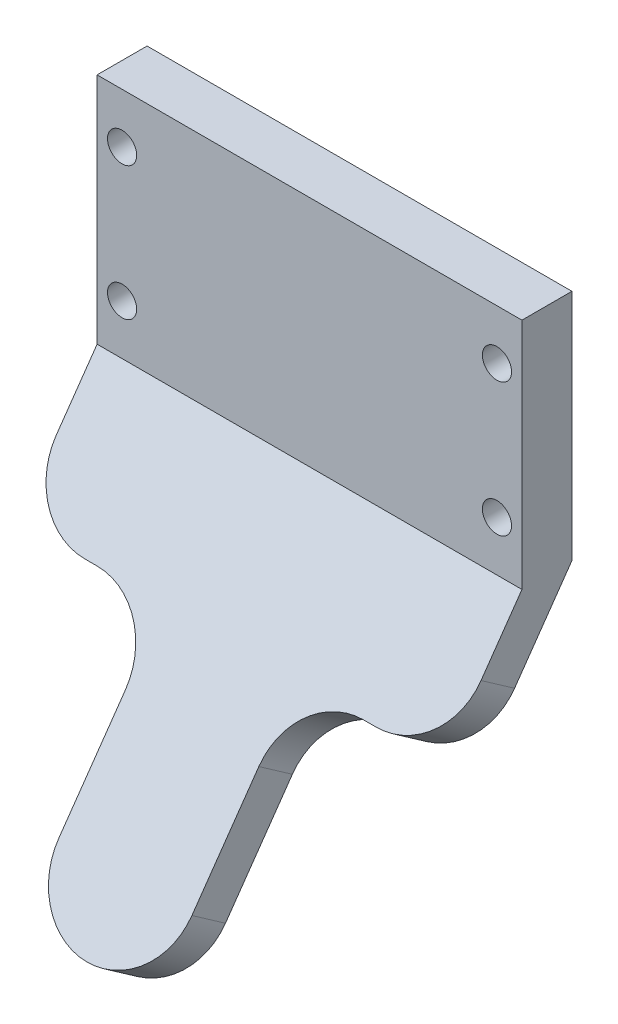
ISO-10303-21;
HEADER;
FILE_DESCRIPTION(('STEP AP214'),'2;1');
FILE_NAME('part.step','',(''),(''),'','','');
FILE_SCHEMA(('AUTOMOTIVE_DESIGN { 1 0 10303 214 1 1 1 1 }'));
ENDSEC;
DATA;
#1=APPLICATION_CONTEXT('core data for automotive mechanical design processes');
#2=APPLICATION_PROTOCOL_DEFINITION('international standard','automotive_design',2000,#1);
#3=PRODUCT_CONTEXT('',#1,'mechanical');
#4=PRODUCT('Part','Part','',(#3));
#5=PRODUCT_RELATED_PRODUCT_CATEGORY('part','',(#4));
#6=PRODUCT_DEFINITION_FORMATION('','',#4);
#7=PRODUCT_DEFINITION_CONTEXT('part definition',#1,'design');
#8=PRODUCT_DEFINITION('design','',#6,#7);
#9=PRODUCT_DEFINITION_SHAPE('','',#8);
#10=(LENGTH_UNIT() NAMED_UNIT(*) SI_UNIT(.MILLI.,.METRE.));
#11=(NAMED_UNIT(*) PLANE_ANGLE_UNIT() SI_UNIT($,.RADIAN.));
#12=(NAMED_UNIT(*) SI_UNIT($,.STERADIAN.) SOLID_ANGLE_UNIT());
#13=UNCERTAINTY_MEASURE_WITH_UNIT(LENGTH_MEASURE(1.E-05),#10,'distance_accuracy_value','');
#14=(GEOMETRIC_REPRESENTATION_CONTEXT(3) GLOBAL_UNCERTAINTY_ASSIGNED_CONTEXT((#13)) GLOBAL_UNIT_ASSIGNED_CONTEXT((#10,
#11,#12)) REPRESENTATION_CONTEXT('',''));
#15=CARTESIAN_POINT('',(0.,0.,0.));
#16=DIRECTION('',(0.,0.,1.));
#17=DIRECTION('',(1.,0.,0.));
#18=AXIS2_PLACEMENT_3D('',#15,#16,#17);
#19=CARTESIAN_POINT('',(0.,0.,6.));
#20=DIRECTION('',(1.,0.,0.));
#21=DIRECTION('',(0.,0.,-1.));
#22=AXIS2_PLACEMENT_3D('',#19,#20,#21);
#23=PLANE('',#22);
#24=DIRECTION('',(0.,-0.819152044288995,0.573576436351042));
#25=VECTOR('',#24,1.);
#26=CARTESIAN_POINT('',(0.,0.,0.));
#27=LINE('',#26,#25);
#28=CARTESIAN_POINT('',(0.,0.,0.));
#29=VERTEX_POINT('',#28);
#30=CARTESIAN_POINT('',(0.,-9.82982453146795,6.88291723621251));
#31=VERTEX_POINT('',#30);
#32=EDGE_CURVE('E148',#29,#31,#27,.T.);
#33=ORIENTED_EDGE('',*,*,#32,.T.);
#34=DIRECTION('',(0.,-0.573576436351042,-0.819152044288995));
#35=VECTOR('',#34,1.);
#36=CARTESIAN_POINT('',(0.,-7.01074666911023,10.9089776661895));
#37=LINE('',#36,#35);
#38=CARTESIAN_POINT('',(0.,-7.01074666911024,10.9089776661895));
#39=VERTEX_POINT('',#38);
#40=EDGE_CURVE('E231',#31,#39,#37,.F.);
#41=ORIENTED_EDGE('',*,*,#40,.T.);
#42=DIRECTION('',(0.,0.819152044288995,-0.573576436351041));
#43=VECTOR('',#42,1.);
#44=CARTESIAN_POINT('',(0.,-38.138524352092,32.7048822475291));
#45=LINE('',#44,#43);
#46=CARTESIAN_POINT('',(0.,0.,6.));
#47=VERTEX_POINT('',#46);
#48=EDGE_CURVE('E168',#39,#47,#45,.T.);
#49=ORIENTED_EDGE('',*,*,#48,.T.);
#50=DIRECTION('',(0.,-1.,0.));
#51=VECTOR('',#50,1.);
#52=CARTESIAN_POINT('',(0.,0.,6.));
#53=LINE('',#52,#51);
#54=CARTESIAN_POINT('',(0.,28.,6.));
#55=VERTEX_POINT('',#54);
#56=EDGE_CURVE('E202',#55,#47,#53,.T.);
#57=ORIENTED_EDGE('',*,*,#56,.F.);
#58=DIRECTION('',(0.,0.,-1.));
#59=VECTOR('',#58,1.);
#60=CARTESIAN_POINT('',(0.,28.,6.));
#61=LINE('',#60,#59);
#62=CARTESIAN_POINT('',(0.,28.,0.));
#63=VERTEX_POINT('',#62);
#64=EDGE_CURVE('E152',#55,#63,#61,.T.);
#65=ORIENTED_EDGE('',*,*,#64,.T.);
#66=DIRECTION('',(0.,-1.,0.));
#67=VECTOR('',#66,1.);
#68=CARTESIAN_POINT('',(0.,0.,0.));
#69=LINE('',#68,#67);
#70=EDGE_CURVE('E145',#63,#29,#69,.T.);
#71=ORIENTED_EDGE('',*,*,#70,.T.);
#72=EDGE_LOOP('',(#33,#41,#49,#57,#65,#71));
#73=FACE_BOUND('',#72,.T.);
#74=ADVANCED_FACE('F35',(#73),#23,.F.);
#75=CARTESIAN_POINT('',(51.,0.,6.));
#76=DIRECTION('',(-1.,0.,0.));
#77=DIRECTION('',(0.,0.,1.));
#78=AXIS2_PLACEMENT_3D('',#75,#76,#77);
#79=PLANE('',#78);
#80=DIRECTION('',(0.,0.819152044288995,-0.573576436351041));
#81=VECTOR('',#80,1.);
#82=CARTESIAN_POINT('',(51.,-38.138524352092,32.7048822475291));
#83=LINE('',#82,#81);
#84=CARTESIAN_POINT('',(51.,-7.01074666911024,10.9089776661895));
#85=VERTEX_POINT('',#84);
#86=CARTESIAN_POINT('',(51.,0.,6.));
#87=VERTEX_POINT('',#86);
#88=EDGE_CURVE('E176',#85,#87,#83,.T.);
#89=ORIENTED_EDGE('',*,*,#88,.F.);
#90=DIRECTION('',(0.,-0.573576436351042,-0.819152044288995));
#91=VECTOR('',#90,1.);
#92=CARTESIAN_POINT('',(51.,-7.01074666911023,10.9089776661895));
#93=LINE('',#92,#91);
#94=CARTESIAN_POINT('',(51.,-9.82982453146795,6.88291723621251));
#95=VERTEX_POINT('',#94);
#96=EDGE_CURVE('E240',#85,#95,#93,.T.);
#97=ORIENTED_EDGE('',*,*,#96,.T.);
#98=DIRECTION('',(0.,-0.819152044288995,0.573576436351042));
#99=VECTOR('',#98,1.);
#100=CARTESIAN_POINT('',(51.,0.,0.));
#101=LINE('',#100,#99);
#102=CARTESIAN_POINT('',(51.,0.,0.));
#103=VERTEX_POINT('',#102);
#104=EDGE_CURVE('E171',#103,#95,#101,.T.);
#105=ORIENTED_EDGE('',*,*,#104,.F.);
#106=DIRECTION('',(0.,1.,0.));
#107=VECTOR('',#106,1.);
#108=CARTESIAN_POINT('',(51.,0.,0.));
#109=LINE('',#108,#107);
#110=CARTESIAN_POINT('',(51.,28.,0.));
#111=VERTEX_POINT('',#110);
#112=EDGE_CURVE('E160',#103,#111,#109,.T.);
#113=ORIENTED_EDGE('',*,*,#112,.T.);
#114=DIRECTION('',(0.,0.,-1.));
#115=VECTOR('',#114,1.);
#116=CARTESIAN_POINT('',(51.,28.,6.));
#117=LINE('',#116,#115);
#118=CARTESIAN_POINT('',(51.,28.,6.));
#119=VERTEX_POINT('',#118);
#120=EDGE_CURVE('E216',#119,#111,#117,.T.);
#121=ORIENTED_EDGE('',*,*,#120,.F.);
#122=DIRECTION('',(0.,1.,0.));
#123=VECTOR('',#122,1.);
#124=CARTESIAN_POINT('',(51.,0.,6.));
#125=LINE('',#124,#123);
#126=EDGE_CURVE('E209',#87,#119,#125,.T.);
#127=ORIENTED_EDGE('',*,*,#126,.F.);
#128=EDGE_LOOP('',(#89,#97,#105,#113,#121,#127));
#129=FACE_BOUND('',#128,.T.);
#130=ADVANCED_FACE('F304',(#129),#79,.F.);
#131=CARTESIAN_POINT('',(0.,28.,6.));
#132=DIRECTION('',(0.,-1.,0.));
#133=DIRECTION('',(0.,0.,-1.));
#134=AXIS2_PLACEMENT_3D('',#131,#132,#133);
#135=PLANE('',#134);
#136=DIRECTION('',(-1.,0.,0.));
#137=VECTOR('',#136,1.);
#138=CARTESIAN_POINT('',(0.,28.,0.));
#139=LINE('',#138,#137);
#140=EDGE_CURVE('E206',#111,#63,#139,.T.);
#141=ORIENTED_EDGE('',*,*,#140,.T.);
#142=ORIENTED_EDGE('',*,*,#64,.F.);
#143=DIRECTION('',(-1.,0.,0.));
#144=VECTOR('',#143,1.);
#145=CARTESIAN_POINT('',(0.,28.,6.));
#146=LINE('',#145,#144);
#147=EDGE_CURVE('E211',#119,#55,#146,.T.);
#148=ORIENTED_EDGE('',*,*,#147,.F.);
#149=ORIENTED_EDGE('',*,*,#120,.T.);
#150=EDGE_LOOP('',(#141,#142,#148,#149));
#151=FACE_BOUND('',#150,.T.);
#152=ADVANCED_FACE('F307',(#151),#135,.F.);
#153=CARTESIAN_POINT('',(0.,0.,6.));
#154=DIRECTION('',(0.,0.,-1.));
#155=DIRECTION('',(-1.,0.,0.));
#156=AXIS2_PLACEMENT_3D('',#153,#154,#155);
#157=PLANE('',#156);
#158=CARTESIAN_POINT('',(3.,22.,6.));
#159=DIRECTION('',(0.,0.,1.));
#160=DIRECTION('',(1.,0.,0.));
#161=AXIS2_PLACEMENT_3D('',#158,#159,#160);
#162=CIRCLE('',#161,1.75);
#163=CARTESIAN_POINT('',(4.75,22.,6.));
#164=VERTEX_POINT('',#163);
#165=EDGE_CURVE('E183',#164,#164,#162,.T.);
#166=ORIENTED_EDGE('',*,*,#165,.F.);
#167=EDGE_LOOP('',(#166));
#168=FACE_BOUND('',#167,.T.);
#169=CARTESIAN_POINT('',(48.,22.,6.));
#170=DIRECTION('',(0.,0.,1.));
#171=DIRECTION('',(-1.,0.,0.));
#172=AXIS2_PLACEMENT_3D('',#169,#170,#171);
#173=CIRCLE('',#172,1.75000000000001);
#174=CARTESIAN_POINT('',(46.25,22.,6.));
#175=VERTEX_POINT('',#174);
#176=EDGE_CURVE('E189',#175,#175,#173,.T.);
#177=ORIENTED_EDGE('',*,*,#176,.F.);
#178=EDGE_LOOP('',(#177));
#179=FACE_BOUND('',#178,.T.);
#180=CARTESIAN_POINT('',(48.,6.,6.));
#181=DIRECTION('',(0.,0.,1.));
#182=DIRECTION('',(-1.,0.,0.));
#183=AXIS2_PLACEMENT_3D('',#180,#181,#182);
#184=CIRCLE('',#183,1.75);
#185=CARTESIAN_POINT('',(46.25,6.,6.));
#186=VERTEX_POINT('',#185);
#187=EDGE_CURVE('E195',#186,#186,#184,.T.);
#188=ORIENTED_EDGE('',*,*,#187,.F.);
#189=EDGE_LOOP('',(#188));
#190=FACE_BOUND('',#189,.T.);
#191=CARTESIAN_POINT('',(3.,6.,6.));
#192=DIRECTION('',(0.,0.,1.));
#193=DIRECTION('',(1.,0.,0.));
#194=AXIS2_PLACEMENT_3D('',#191,#192,#193);
#195=CIRCLE('',#194,1.75);
#196=CARTESIAN_POINT('',(4.75,6.,6.));
#197=VERTEX_POINT('',#196);
#198=EDGE_CURVE('E182',#197,#197,#195,.T.);
#199=ORIENTED_EDGE('',*,*,#198,.F.);
#200=EDGE_LOOP('',(#199));
#201=FACE_BOUND('',#200,.T.);
#202=ORIENTED_EDGE('',*,*,#56,.T.);
#203=DIRECTION('',(1.,0.,0.));
#204=VECTOR('',#203,1.);
#205=CARTESIAN_POINT('',(0.,0.,6.));
#206=LINE('',#205,#204);
#207=EDGE_CURVE('E205',#47,#87,#206,.T.);
#208=ORIENTED_EDGE('',*,*,#207,.T.);
#209=ORIENTED_EDGE('',*,*,#126,.T.);
#210=ORIENTED_EDGE('',*,*,#147,.T.);
#211=EDGE_LOOP('',(#202,#208,#209,#210));
#212=FACE_BOUND('',#211,.T.);
#213=ADVANCED_FACE('F302',(#168,#179,#190,#201,#212),#157,.F.);
#214=CARTESIAN_POINT('',(0.,0.,0.));
#215=DIRECTION('',(0.,0.,-1.));
#216=DIRECTION('',(-1.,0.,0.));
#217=AXIS2_PLACEMENT_3D('',#214,#215,#216);
#218=PLANE('',#217);
#219=CARTESIAN_POINT('',(3.,22.,0.));
#220=DIRECTION('',(0.,0.,1.));
#221=DIRECTION('',(1.,0.,0.));
#222=AXIS2_PLACEMENT_3D('',#219,#220,#221);
#223=CIRCLE('',#222,1.75);
#224=CARTESIAN_POINT('',(4.75,22.,0.));
#225=VERTEX_POINT('',#224);
#226=EDGE_CURVE('E179',#225,#225,#223,.T.);
#227=ORIENTED_EDGE('',*,*,#226,.T.);
#228=EDGE_LOOP('',(#227));
#229=FACE_BOUND('',#228,.T.);
#230=CARTESIAN_POINT('',(48.,22.,0.));
#231=DIRECTION('',(0.,0.,1.));
#232=DIRECTION('',(-1.,0.,0.));
#233=AXIS2_PLACEMENT_3D('',#230,#231,#232);
#234=CIRCLE('',#233,1.75000000000001);
#235=CARTESIAN_POINT('',(46.25,22.,0.));
#236=VERTEX_POINT('',#235);
#237=EDGE_CURVE('E186',#236,#236,#234,.T.);
#238=ORIENTED_EDGE('',*,*,#237,.T.);
#239=EDGE_LOOP('',(#238));
#240=FACE_BOUND('',#239,.T.);
#241=CARTESIAN_POINT('',(48.,6.,0.));
#242=DIRECTION('',(0.,0.,1.));
#243=DIRECTION('',(-1.,0.,0.));
#244=AXIS2_PLACEMENT_3D('',#241,#242,#243);
#245=CIRCLE('',#244,1.75);
#246=CARTESIAN_POINT('',(46.25,6.,0.));
#247=VERTEX_POINT('',#246);
#248=EDGE_CURVE('E192',#247,#247,#245,.T.);
#249=ORIENTED_EDGE('',*,*,#248,.T.);
#250=EDGE_LOOP('',(#249));
#251=FACE_BOUND('',#250,.T.);
#252=CARTESIAN_POINT('',(3.,6.,0.));
#253=DIRECTION('',(0.,0.,1.));
#254=DIRECTION('',(1.,0.,0.));
#255=AXIS2_PLACEMENT_3D('',#252,#253,#254);
#256=CIRCLE('',#255,1.75);
#257=CARTESIAN_POINT('',(4.75,6.,0.));
#258=VERTEX_POINT('',#257);
#259=EDGE_CURVE('E156',#258,#258,#256,.T.);
#260=ORIENTED_EDGE('',*,*,#259,.T.);
#261=EDGE_LOOP('',(#260));
#262=FACE_BOUND('',#261,.T.);
#263=ORIENTED_EDGE('',*,*,#70,.F.);
#264=ORIENTED_EDGE('',*,*,#140,.F.);
#265=ORIENTED_EDGE('',*,*,#112,.F.);
#266=DIRECTION('',(1.,0.,0.));
#267=VECTOR('',#266,1.);
#268=CARTESIAN_POINT('',(0.,0.,0.));
#269=LINE('',#268,#267);
#270=EDGE_CURVE('E155',#29,#103,#269,.T.);
#271=ORIENTED_EDGE('',*,*,#270,.F.);
#272=EDGE_LOOP('',(#263,#264,#265,#271));
#273=FACE_BOUND('',#272,.T.);
#274=ADVANCED_FACE('F159',(#229,#240,#251,#262,#273),#218,.T.);
#275=CARTESIAN_POINT('',(3.,6.,0.));
#276=DIRECTION('',(0.,0.,1.));
#277=DIRECTION('',(1.,0.,0.));
#278=AXIS2_PLACEMENT_3D('',#275,#276,#277);
#279=CYLINDRICAL_SURFACE('',#278,1.75);
#280=ORIENTED_EDGE('',*,*,#259,.F.);
#281=EDGE_LOOP('',(#280));
#282=FACE_BOUND('',#281,.T.);
#283=ORIENTED_EDGE('',*,*,#198,.T.);
#284=EDGE_LOOP('',(#283));
#285=FACE_BOUND('',#284,.T.);
#286=ADVANCED_FACE('F333',(#282,#285),#279,.F.);
#287=CARTESIAN_POINT('',(48.,6.,0.));
#288=DIRECTION('',(0.,0.,1.));
#289=DIRECTION('',(1.,0.,0.));
#290=AXIS2_PLACEMENT_3D('',#287,#288,#289);
#291=CYLINDRICAL_SURFACE('',#290,1.75);
#292=ORIENTED_EDGE('',*,*,#248,.F.);
#293=EDGE_LOOP('',(#292));
#294=FACE_BOUND('',#293,.T.);
#295=ORIENTED_EDGE('',*,*,#187,.T.);
#296=EDGE_LOOP('',(#295));
#297=FACE_BOUND('',#296,.T.);
#298=ADVANCED_FACE('F340',(#294,#297),#291,.F.);
#299=CARTESIAN_POINT('',(48.,22.,0.));
#300=DIRECTION('',(0.,0.,1.));
#301=DIRECTION('',(1.,0.,0.));
#302=AXIS2_PLACEMENT_3D('',#299,#300,#301);
#303=CYLINDRICAL_SURFACE('',#302,1.75000000000001);
#304=ORIENTED_EDGE('',*,*,#237,.F.);
#305=EDGE_LOOP('',(#304));
#306=FACE_BOUND('',#305,.T.);
#307=ORIENTED_EDGE('',*,*,#176,.T.);
#308=EDGE_LOOP('',(#307));
#309=FACE_BOUND('',#308,.T.);
#310=ADVANCED_FACE('F344',(#306,#309),#303,.F.);
#311=CARTESIAN_POINT('',(3.,22.,0.));
#312=DIRECTION('',(0.,0.,1.));
#313=DIRECTION('',(1.,0.,0.));
#314=AXIS2_PLACEMENT_3D('',#311,#312,#313);
#315=CYLINDRICAL_SURFACE('',#314,1.75);
#316=ORIENTED_EDGE('',*,*,#226,.F.);
#317=EDGE_LOOP('',(#316));
#318=FACE_BOUND('',#317,.T.);
#319=ORIENTED_EDGE('',*,*,#165,.T.);
#320=EDGE_LOOP('',(#319));
#321=FACE_BOUND('',#320,.T.);
#322=ADVANCED_FACE('F348',(#318,#321),#315,.F.);
#323=CARTESIAN_POINT('',(51.,-38.138524352092,32.7048822475291));
#324=DIRECTION('',(0.,0.573576436351041,0.819152044288995));
#325=DIRECTION('',(0.,-0.819152044288995,0.573576436351041));
#326=AXIS2_PLACEMENT_3D('',#323,#324,#325);
#327=PLANE('',#326);
#328=ORIENTED_EDGE('',*,*,#48,.F.);
#329=CARTESIAN_POINT('',(8.,-7.01074666911024,10.9089776661895));
#330=DIRECTION('',(0.,0.573576436351041,0.819152044288995));
#331=DIRECTION('',(0.,-0.819152044288995,0.573576436351041));
#332=AXIS2_PLACEMENT_3D('',#329,#330,#331);
#333=CIRCLE('',#332,8.);
#334=CARTESIAN_POINT('',(8.,-13.5639630234222,15.4975891569979));
#335=VERTEX_POINT('',#334);
#336=EDGE_CURVE('E238',#39,#335,#333,.T.);
#337=ORIENTED_EDGE('',*,*,#336,.T.);
#338=DIRECTION('',(1.,0.,0.));
#339=VECTOR('',#338,1.);
#340=CARTESIAN_POINT('',(0.,-13.5639630234222,15.4975891569979));
#341=LINE('',#340,#339);
#342=CARTESIAN_POINT('',(9.49999999999999,-13.5639630234222,15.4975891569979));
#343=VERTEX_POINT('',#342);
#344=EDGE_CURVE('E283',#335,#343,#341,.T.);
#345=ORIENTED_EDGE('',*,*,#344,.T.);
#346=CARTESIAN_POINT('',(9.49999999999999,-20.1171793777342,20.0862006478062));
#347=DIRECTION('',(0.,0.573576436351041,0.819152044288995));
#348=DIRECTION('',(0.,-0.819152044288995,0.573576436351041));
#349=AXIS2_PLACEMENT_3D('',#346,#347,#348);
#350=CIRCLE('',#349,8.);
#351=CARTESIAN_POINT('',(17.5,-20.1171793777342,20.0862006478062));
#352=VERTEX_POINT('',#351);
#353=EDGE_CURVE('E11',#343,#352,#350,.F.);
#354=ORIENTED_EDGE('',*,*,#353,.T.);
#355=DIRECTION('',(0.,-0.819152044288995,0.573576436351042));
#356=VECTOR('',#355,1.);
#357=CARTESIAN_POINT('',(17.5,-38.1385243520921,32.7048822475291));
#358=LINE('',#357,#356);
#359=CARTESIAN_POINT('',(17.5,-31.5853079977801,28.1162707567208));
#360=VERTEX_POINT('',#359);
#361=EDGE_CURVE('E281',#352,#360,#358,.T.);
#362=ORIENTED_EDGE('',*,*,#361,.T.);
#363=CARTESIAN_POINT('',(25.5,-31.5853079977801,28.1162707567208));
#364=DIRECTION('',(0.,0.573576436351041,0.819152044288995));
#365=DIRECTION('',(0.,-0.819152044288995,0.573576436351041));
#366=AXIS2_PLACEMENT_3D('',#363,#364,#365);
#367=CIRCLE('',#366,8.);
#368=CARTESIAN_POINT('',(25.5,-38.138524352092,32.7048822475291));
#369=VERTEX_POINT('',#368);
#370=EDGE_CURVE('E233',#360,#369,#367,.T.);
#371=ORIENTED_EDGE('',*,*,#370,.T.);
#372=CARTESIAN_POINT('',(25.5,-31.5853079977801,28.1162707567208));
#373=DIRECTION('',(0.,0.573576436351041,0.819152044288995));
#374=DIRECTION('',(0.,-0.819152044288995,0.573576436351041));
#375=AXIS2_PLACEMENT_3D('',#372,#373,#374);
#376=CIRCLE('',#375,8.);
#377=CARTESIAN_POINT('',(33.5,-31.5853079977801,28.1162707567208));
#378=VERTEX_POINT('',#377);
#379=EDGE_CURVE('E235',#369,#378,#376,.T.);
#380=ORIENTED_EDGE('',*,*,#379,.T.);
#381=DIRECTION('',(0.,0.819152044288995,-0.573576436351042));
#382=VECTOR('',#381,1.);
#383=CARTESIAN_POINT('',(33.5,-38.1385243520921,32.7048822475291));
#384=LINE('',#383,#382);
#385=CARTESIAN_POINT('',(33.5,-20.1171793777342,20.0862006478062));
#386=VERTEX_POINT('',#385);
#387=EDGE_CURVE('E173',#378,#386,#384,.T.);
#388=ORIENTED_EDGE('',*,*,#387,.T.);
#389=CARTESIAN_POINT('',(41.5,-20.1171793777342,20.0862006478062));
#390=DIRECTION('',(0.,0.573576436351041,0.819152044288995));
#391=DIRECTION('',(0.,-0.819152044288995,0.573576436351041));
#392=AXIS2_PLACEMENT_3D('',#389,#390,#391);
#393=CIRCLE('',#392,8.);
#394=CARTESIAN_POINT('',(41.5,-13.5639630234222,15.4975891569979));
#395=VERTEX_POINT('',#394);
#396=EDGE_CURVE('E259',#386,#395,#393,.F.);
#397=ORIENTED_EDGE('',*,*,#396,.T.);
#398=DIRECTION('',(1.,0.,0.));
#399=VECTOR('',#398,1.);
#400=CARTESIAN_POINT('',(51.,-13.5639630234222,15.4975891569979));
#401=LINE('',#400,#399);
#402=CARTESIAN_POINT('',(43.,-13.5639630234222,15.4975891569979));
#403=VERTEX_POINT('',#402);
#404=EDGE_CURVE('E169',#395,#403,#401,.T.);
#405=ORIENTED_EDGE('',*,*,#404,.T.);
#406=CARTESIAN_POINT('',(43.,-7.01074666911024,10.9089776661895));
#407=DIRECTION('',(0.,0.573576436351041,0.819152044288995));
#408=DIRECTION('',(0.,-0.819152044288995,0.573576436351041));
#409=AXIS2_PLACEMENT_3D('',#406,#407,#408);
#410=CIRCLE('',#409,8.);
#411=EDGE_CURVE('E51',#403,#85,#410,.T.);
#412=ORIENTED_EDGE('',*,*,#411,.T.);
#413=ORIENTED_EDGE('',*,*,#88,.T.);
#414=ORIENTED_EDGE('',*,*,#207,.F.);
#415=EDGE_LOOP('',(#328,#337,#345,#354,#362,#371,#380,#388,#397,#405,#412,#413,#414));
#416=FACE_BOUND('',#415,.T.);
#417=ADVANCED_FACE('F280',(#416),#327,.T.);
#418=CARTESIAN_POINT('',(51.,0.,0.));
#419=DIRECTION('',(0.,-0.573576436351042,-0.819152044288995));
#420=DIRECTION('',(0.,0.819152044288995,-0.573576436351042));
#421=AXIS2_PLACEMENT_3D('',#418,#419,#420);
#422=PLANE('',#421);
#423=DIRECTION('',(1.,0.,0.));
#424=VECTOR('',#423,1.);
#425=CARTESIAN_POINT('',(0.,-16.3830408857799,11.4715287270208));
#426=LINE('',#425,#424);
#427=CARTESIAN_POINT('',(8.,-16.3830408857799,11.4715287270208));
#428=VERTEX_POINT('',#427);
#429=CARTESIAN_POINT('',(9.49999999999999,-16.3830408857799,11.4715287270208));
#430=VERTEX_POINT('',#429);
#431=EDGE_CURVE('E263',#428,#430,#426,.T.);
#432=ORIENTED_EDGE('',*,*,#431,.F.);
#433=CARTESIAN_POINT('',(8.,-9.82982453146795,6.88291723621251));
#434=DIRECTION('',(0.,-0.573576436351042,-0.819152044288995));
#435=DIRECTION('',(0.,0.819152044288995,-0.573576436351042));
#436=AXIS2_PLACEMENT_3D('',#433,#434,#435);
#437=CIRCLE('',#436,8.);
#438=EDGE_CURVE('E167',#428,#31,#437,.T.);
#439=ORIENTED_EDGE('',*,*,#438,.T.);
#440=ORIENTED_EDGE('',*,*,#32,.F.);
#441=ORIENTED_EDGE('',*,*,#270,.T.);
#442=ORIENTED_EDGE('',*,*,#104,.T.);
#443=CARTESIAN_POINT('',(43.,-9.82982453146795,6.88291723621251));
#444=DIRECTION('',(0.,-0.573576436351042,-0.819152044288995));
#445=DIRECTION('',(0.,0.819152044288995,-0.573576436351042));
#446=AXIS2_PLACEMENT_3D('',#443,#444,#445);
#447=CIRCLE('',#446,8.);
#448=CARTESIAN_POINT('',(43.,-16.3830408857799,11.4715287270208));
#449=VERTEX_POINT('',#448);
#450=EDGE_CURVE('E228',#95,#449,#447,.T.);
#451=ORIENTED_EDGE('',*,*,#450,.T.);
#452=DIRECTION('',(1.,0.,0.));
#453=VECTOR('',#452,1.);
#454=CARTESIAN_POINT('',(51.,-16.3830408857799,11.4715287270208));
#455=LINE('',#454,#453);
#456=CARTESIAN_POINT('',(41.5,-16.3830408857799,11.4715287270208));
#457=VERTEX_POINT('',#456);
#458=EDGE_CURVE('E290',#457,#449,#455,.T.);
#459=ORIENTED_EDGE('',*,*,#458,.F.);
#460=CARTESIAN_POINT('',(41.5,-22.9362572400919,16.0601402178292));
#461=DIRECTION('',(0.,-0.573576436351042,-0.819152044288995));
#462=DIRECTION('',(0.,0.819152044288995,-0.573576436351042));
#463=AXIS2_PLACEMENT_3D('',#460,#461,#462);
#464=CIRCLE('',#463,8.);
#465=CARTESIAN_POINT('',(33.5,-22.9362572400919,16.0601402178292));
#466=VERTEX_POINT('',#465);
#467=EDGE_CURVE('E257',#457,#466,#464,.F.);
#468=ORIENTED_EDGE('',*,*,#467,.T.);
#469=DIRECTION('',(0.,0.819152044288995,-0.573576436351042));
#470=VECTOR('',#469,1.);
#471=CARTESIAN_POINT('',(33.5,-40.9576022144498,28.6788218175521));
#472=LINE('',#471,#470);
#473=CARTESIAN_POINT('',(33.5,-34.4043858601378,24.0902103267438));
#474=VERTEX_POINT('',#473);
#475=EDGE_CURVE('E287',#474,#466,#472,.T.);
#476=ORIENTED_EDGE('',*,*,#475,.F.);
#477=CARTESIAN_POINT('',(25.5,-34.4043858601378,24.0902103267438));
#478=DIRECTION('',(0.,-0.573576436351042,-0.819152044288995));
#479=DIRECTION('',(0.,0.819152044288995,-0.573576436351042));
#480=AXIS2_PLACEMENT_3D('',#477,#478,#479);
#481=CIRCLE('',#480,8.);
#482=CARTESIAN_POINT('',(25.5,-40.9576022144497,28.6788218175521));
#483=VERTEX_POINT('',#482);
#484=EDGE_CURVE('E226',#474,#483,#481,.T.);
#485=ORIENTED_EDGE('',*,*,#484,.T.);
#486=CARTESIAN_POINT('',(25.5,-34.4043858601378,24.0902103267438));
#487=DIRECTION('',(0.,-0.573576436351042,-0.819152044288995));
#488=DIRECTION('',(0.,0.819152044288995,-0.573576436351042));
#489=AXIS2_PLACEMENT_3D('',#486,#487,#488);
#490=CIRCLE('',#489,8.);
#491=CARTESIAN_POINT('',(17.5,-34.4043858601378,24.0902103267438));
#492=VERTEX_POINT('',#491);
#493=EDGE_CURVE('E224',#483,#492,#490,.T.);
#494=ORIENTED_EDGE('',*,*,#493,.T.);
#495=DIRECTION('',(0.,-0.819152044288995,0.573576436351042));
#496=VECTOR('',#495,1.);
#497=CARTESIAN_POINT('',(17.5,-40.9576022144498,28.6788218175521));
#498=LINE('',#497,#496);
#499=CARTESIAN_POINT('',(17.5,-22.9362572400919,16.0601402178292));
#500=VERTEX_POINT('',#499);
#501=EDGE_CURVE('E265',#500,#492,#498,.T.);
#502=ORIENTED_EDGE('',*,*,#501,.F.);
#503=CARTESIAN_POINT('',(9.49999999999999,-22.9362572400919,16.0601402178292));
#504=DIRECTION('',(0.,-0.573576436351042,-0.819152044288995));
#505=DIRECTION('',(0.,0.819152044288995,-0.573576436351042));
#506=AXIS2_PLACEMENT_3D('',#503,#504,#505);
#507=CIRCLE('',#506,8.);
#508=EDGE_CURVE('E44',#500,#430,#507,.F.);
#509=ORIENTED_EDGE('',*,*,#508,.T.);
#510=EDGE_LOOP('',(#432,#439,#440,#441,#442,#451,#459,#468,#476,#485,#494,#502,#509));
#511=FACE_BOUND('',#510,.T.);
#512=ADVANCED_FACE('F166',(#511),#422,.T.);
#513=CARTESIAN_POINT('',(51.,-13.5639630234222,15.4975891569979));
#514=DIRECTION('',(0.,0.819152044288995,-0.573576436351042));
#515=DIRECTION('',(0.,0.573576436351042,0.819152044288995));
#516=AXIS2_PLACEMENT_3D('',#513,#514,#515);
#517=PLANE('',#516);
#518=ORIENTED_EDGE('',*,*,#458,.T.);
#519=DIRECTION('',(0.,-0.573576436351042,-0.819152044288995));
#520=VECTOR('',#519,1.);
#521=CARTESIAN_POINT('',(43.,-13.5639630234222,15.4975891569979));
#522=LINE('',#521,#520);
#523=EDGE_CURVE('E59',#449,#403,#522,.F.);
#524=ORIENTED_EDGE('',*,*,#523,.T.);
#525=ORIENTED_EDGE('',*,*,#404,.F.);
#526=DIRECTION('',(0.,-0.573576436351042,-0.819152044288995));
#527=VECTOR('',#526,1.);
#528=CARTESIAN_POINT('',(41.5,-16.3830408857799,11.4715287270208));
#529=LINE('',#528,#527);
#530=EDGE_CURVE('E243',#395,#457,#529,.T.);
#531=ORIENTED_EDGE('',*,*,#530,.T.);
#532=EDGE_LOOP('',(#518,#524,#525,#531));
#533=FACE_BOUND('',#532,.T.);
#534=ADVANCED_FACE('F355',(#533),#517,.F.);
#535=CARTESIAN_POINT('',(33.5,-38.1385243520921,32.7048822475291));
#536=DIRECTION('',(-1.,0.,0.));
#537=DIRECTION('',(0.,0.,1.));
#538=AXIS2_PLACEMENT_3D('',#535,#536,#537);
#539=PLANE('',#538);
#540=ORIENTED_EDGE('',*,*,#475,.T.);
#541=DIRECTION('',(0.,-0.573576436351042,-0.819152044288995));
#542=VECTOR('',#541,1.);
#543=CARTESIAN_POINT('',(33.5,-20.1171793777342,20.0862006478062));
#544=LINE('',#543,#542);
#545=EDGE_CURVE('E250',#466,#386,#544,.F.);
#546=ORIENTED_EDGE('',*,*,#545,.T.);
#547=ORIENTED_EDGE('',*,*,#387,.F.);
#548=DIRECTION('',(0.,-0.573576436351041,-0.819152044288995));
#549=VECTOR('',#548,1.);
#550=CARTESIAN_POINT('',(33.5,-34.4043858601378,24.0902103267438));
#551=LINE('',#550,#549);
#552=EDGE_CURVE('E247',#378,#474,#551,.T.);
#553=ORIENTED_EDGE('',*,*,#552,.T.);
#554=EDGE_LOOP('',(#540,#546,#547,#553));
#555=FACE_BOUND('',#554,.T.);
#556=ADVANCED_FACE('F358',(#555),#539,.F.);
#557=CARTESIAN_POINT('',(17.5,-38.1385243520921,32.7048822475291));
#558=DIRECTION('',(1.,0.,0.));
#559=DIRECTION('',(0.,0.,-1.));
#560=AXIS2_PLACEMENT_3D('',#557,#558,#559);
#561=PLANE('',#560);
#562=ORIENTED_EDGE('',*,*,#361,.F.);
#563=DIRECTION('',(0.,-0.573576436351042,-0.819152044288995));
#564=VECTOR('',#563,1.);
#565=CARTESIAN_POINT('',(17.5,-22.9362572400919,16.0601402178292));
#566=LINE('',#565,#564);
#567=EDGE_CURVE('E254',#352,#500,#566,.T.);
#568=ORIENTED_EDGE('',*,*,#567,.T.);
#569=ORIENTED_EDGE('',*,*,#501,.T.);
#570=DIRECTION('',(0.,-0.573576436351041,-0.819152044288995));
#571=VECTOR('',#570,1.);
#572=CARTESIAN_POINT('',(17.5,-31.5853079977801,28.1162707567208));
#573=LINE('',#572,#571);
#574=EDGE_CURVE('E252',#492,#360,#573,.F.);
#575=ORIENTED_EDGE('',*,*,#574,.T.);
#576=EDGE_LOOP('',(#562,#568,#569,#575));
#577=FACE_BOUND('',#576,.T.);
#578=ADVANCED_FACE('F285',(#577),#561,.F.);
#579=CARTESIAN_POINT('',(0.,-13.5639630234222,15.4975891569979));
#580=DIRECTION('',(0.,0.819152044288995,-0.573576436351042));
#581=DIRECTION('',(0.,0.573576436351042,0.819152044288995));
#582=AXIS2_PLACEMENT_3D('',#579,#580,#581);
#583=PLANE('',#582);
#584=ORIENTED_EDGE('',*,*,#344,.F.);
#585=DIRECTION('',(0.,-0.573576436351042,-0.819152044288995));
#586=VECTOR('',#585,1.);
#587=CARTESIAN_POINT('',(8.,-13.5639630234222,15.4975891569979));
#588=LINE('',#587,#586);
#589=EDGE_CURVE('E221',#335,#428,#588,.T.);
#590=ORIENTED_EDGE('',*,*,#589,.T.);
#591=ORIENTED_EDGE('',*,*,#431,.T.);
#592=DIRECTION('',(0.,-0.573576436351042,-0.819152044288995));
#593=VECTOR('',#592,1.);
#594=CARTESIAN_POINT('',(9.49999999999999,-13.5639630234222,15.4975891569979));
#595=LINE('',#594,#593);
#596=EDGE_CURVE('E219',#430,#343,#595,.F.);
#597=ORIENTED_EDGE('',*,*,#596,.T.);
#598=EDGE_LOOP('',(#584,#590,#591,#597));
#599=FACE_BOUND('',#598,.T.);
#600=ADVANCED_FACE('F271',(#599),#583,.F.);
#601=CARTESIAN_POINT('',(8.,-7.01074666911024,10.9089776661895));
#602=DIRECTION('',(0.,-0.573576436351042,-0.819152044288995));
#603=DIRECTION('',(0.,0.819152044288995,-0.573576436351042));
#604=AXIS2_PLACEMENT_3D('',#601,#602,#603);
#605=CYLINDRICAL_SURFACE('',#604,8.);
#606=ORIENTED_EDGE('',*,*,#336,.F.);
#607=ORIENTED_EDGE('',*,*,#40,.F.);
#608=ORIENTED_EDGE('',*,*,#438,.F.);
#609=ORIENTED_EDGE('',*,*,#589,.F.);
#610=EDGE_LOOP('',(#606,#607,#608,#609));
#611=FACE_BOUND('',#610,.T.);
#612=ADVANCED_FACE('F310',(#611),#605,.T.);
#613=CARTESIAN_POINT('',(43.,-7.01074666911023,10.9089776661895));
#614=DIRECTION('',(0.,-0.573576436351042,-0.819152044288995));
#615=DIRECTION('',(0.,0.819152044288995,-0.573576436351042));
#616=AXIS2_PLACEMENT_3D('',#613,#614,#615);
#617=CYLINDRICAL_SURFACE('',#616,8.);
#618=ORIENTED_EDGE('',*,*,#411,.F.);
#619=ORIENTED_EDGE('',*,*,#523,.F.);
#620=ORIENTED_EDGE('',*,*,#450,.F.);
#621=ORIENTED_EDGE('',*,*,#96,.F.);
#622=EDGE_LOOP('',(#618,#619,#620,#621));
#623=FACE_BOUND('',#622,.T.);
#624=ADVANCED_FACE('F312',(#623),#617,.T.);
#625=CARTESIAN_POINT('',(41.5,-20.1171793777342,20.0862006478062));
#626=DIRECTION('',(0.,0.573576436351042,0.819152044288995));
#627=DIRECTION('',(0.,-0.819152044288995,0.573576436351042));
#628=AXIS2_PLACEMENT_3D('',#625,#626,#627);
#629=CYLINDRICAL_SURFACE('',#628,8.);
#630=ORIENTED_EDGE('',*,*,#396,.F.);
#631=ORIENTED_EDGE('',*,*,#545,.F.);
#632=ORIENTED_EDGE('',*,*,#467,.F.);
#633=ORIENTED_EDGE('',*,*,#530,.F.);
#634=EDGE_LOOP('',(#630,#631,#632,#633));
#635=FACE_BOUND('',#634,.T.);
#636=ADVANCED_FACE('F318',(#635),#629,.F.);
#637=CARTESIAN_POINT('',(9.49999999999999,-20.1171793777342,20.0862006478062));
#638=DIRECTION('',(0.,0.573576436351042,0.819152044288995));
#639=DIRECTION('',(0.,-0.819152044288995,0.573576436351042));
#640=AXIS2_PLACEMENT_3D('',#637,#638,#639);
#641=CYLINDRICAL_SURFACE('',#640,8.);
#642=ORIENTED_EDGE('',*,*,#353,.F.);
#643=ORIENTED_EDGE('',*,*,#596,.F.);
#644=ORIENTED_EDGE('',*,*,#508,.F.);
#645=ORIENTED_EDGE('',*,*,#567,.F.);
#646=EDGE_LOOP('',(#642,#643,#644,#645));
#647=FACE_BOUND('',#646,.T.);
#648=ADVANCED_FACE('F276',(#647),#641,.F.);
#649=CARTESIAN_POINT('',(25.5,-34.4043858601378,24.0902103267438));
#650=DIRECTION('',(0.,0.573576436351041,0.819152044288995));
#651=DIRECTION('',(0.,-0.819152044288995,0.573576436351041));
#652=AXIS2_PLACEMENT_3D('',#649,#650,#651);
#653=CYLINDRICAL_SURFACE('',#652,8.);
#654=DIRECTION('',(0.,-0.573576436351041,-0.819152044288995));
#655=VECTOR('',#654,1.);
#656=CARTESIAN_POINT('',(25.5,-40.9576022144497,28.6788218175521));
#657=LINE('',#656,#655);
#658=EDGE_CURVE('E39',#369,#483,#657,.T.);
#659=ORIENTED_EDGE('',*,*,#658,.F.);
#660=ORIENTED_EDGE('',*,*,#370,.F.);
#661=ORIENTED_EDGE('',*,*,#574,.F.);
#662=ORIENTED_EDGE('',*,*,#493,.F.);
#663=EDGE_LOOP('',(#659,#660,#661,#662));
#664=FACE_BOUND('',#663,.T.);
#665=ADVANCED_FACE('F37',(#664),#653,.T.);
#666=CARTESIAN_POINT('',(25.5,-31.5853079977801,28.1162707567208));
#667=DIRECTION('',(0.,0.573576436351041,0.819152044288995));
#668=DIRECTION('',(0.,-0.819152044288995,0.573576436351041));
#669=AXIS2_PLACEMENT_3D('',#666,#667,#668);
#670=CYLINDRICAL_SURFACE('',#669,8.);
#671=ORIENTED_EDGE('',*,*,#379,.F.);
#672=ORIENTED_EDGE('',*,*,#658,.T.);
#673=ORIENTED_EDGE('',*,*,#484,.F.);
#674=ORIENTED_EDGE('',*,*,#552,.F.);
#675=EDGE_LOOP('',(#671,#672,#673,#674));
#676=FACE_BOUND('',#675,.T.);
#677=ADVANCED_FACE('F409',(#676),#670,.T.);
#678=CLOSED_SHELL('',(#74,#130,#152,#213,#274,#286,#298,#310,#322,#417,#512,#534,#556,#578,#600,
#612,#624,#636,#648,#665,#677));
#679=MANIFOLD_SOLID_BREP('B2',#678);
#680=ADVANCED_BREP_SHAPE_REPRESENTATION('',(#18,#679),#14);
#681=SHAPE_DEFINITION_REPRESENTATION(#9,#680);
ENDSEC;
END-ISO-10303-21;
